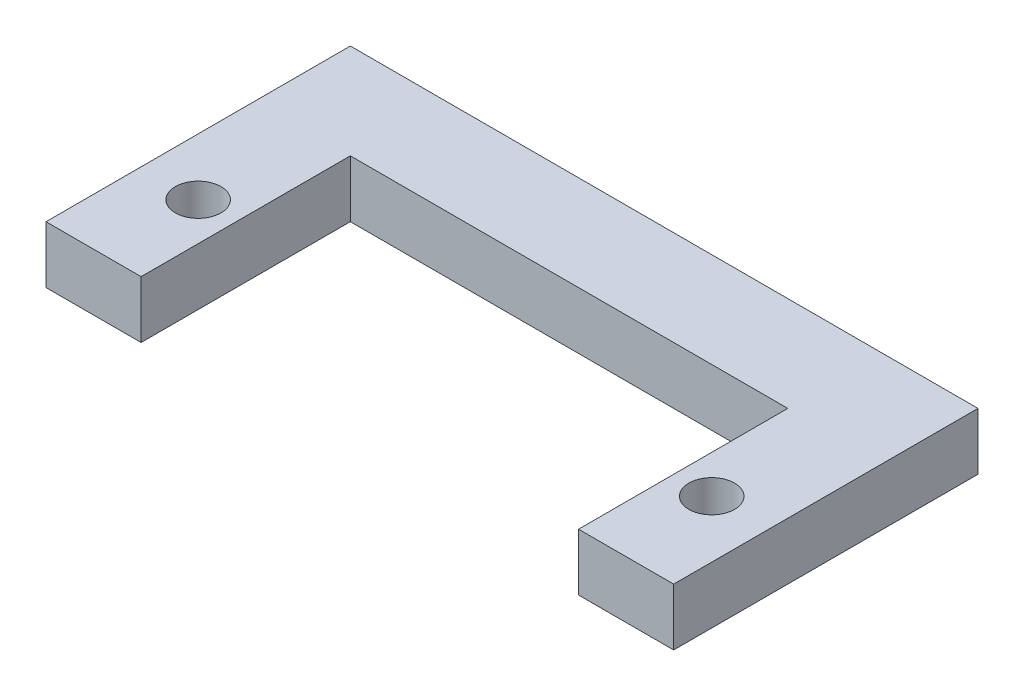
ISO-10303-21;
HEADER;
FILE_DESCRIPTION(('STEP AP214'),'2;1');
FILE_NAME('part.step','',(''),(''),'','','');
FILE_SCHEMA(('AUTOMOTIVE_DESIGN { 1 0 10303 214 1 1 1 1 }'));
ENDSEC;
DATA;
#1=APPLICATION_CONTEXT('core data for automotive mechanical design processes');
#2=APPLICATION_PROTOCOL_DEFINITION('international standard','automotive_design',2000,#1);
#3=PRODUCT_CONTEXT('',#1,'mechanical');
#4=PRODUCT('Part','Part','',(#3));
#5=PRODUCT_RELATED_PRODUCT_CATEGORY('part','',(#4));
#6=PRODUCT_DEFINITION_FORMATION('','',#4);
#7=PRODUCT_DEFINITION_CONTEXT('part definition',#1,'design');
#8=PRODUCT_DEFINITION('design','',#6,#7);
#9=PRODUCT_DEFINITION_SHAPE('','',#8);
#10=(LENGTH_UNIT() NAMED_UNIT(*) SI_UNIT(.MILLI.,.METRE.));
#11=(NAMED_UNIT(*) PLANE_ANGLE_UNIT() SI_UNIT($,.RADIAN.));
#12=(NAMED_UNIT(*) SI_UNIT($,.STERADIAN.) SOLID_ANGLE_UNIT());
#13=UNCERTAINTY_MEASURE_WITH_UNIT(LENGTH_MEASURE(1.E-05),#10,'distance_accuracy_value','');
#14=(GEOMETRIC_REPRESENTATION_CONTEXT(3) GLOBAL_UNCERTAINTY_ASSIGNED_CONTEXT((#13)) GLOBAL_UNIT_ASSIGNED_CONTEXT((#10,
#11,#12)) REPRESENTATION_CONTEXT('',''));
#15=CARTESIAN_POINT('',(0.,0.,0.));
#16=DIRECTION('',(0.,0.,1.));
#17=DIRECTION('',(1.,0.,0.));
#18=AXIS2_PLACEMENT_3D('',#15,#16,#17);
#19=CARTESIAN_POINT('',(0.,3.,0.));
#20=DIRECTION('',(0.,-1.,0.));
#21=DIRECTION('',(0.,0.,-1.));
#22=AXIS2_PLACEMENT_3D('',#19,#20,#21);
#23=PLANE('',#22);
#24=DIRECTION('',(0.,0.,-1.));
#25=VECTOR('',#24,1.);
#26=CARTESIAN_POINT('',(33.,3.,0.));
#27=LINE('',#26,#25);
#28=CARTESIAN_POINT('',(33.,3.,16.));
#29=VERTEX_POINT('',#28);
#30=CARTESIAN_POINT('',(33.,3.,0.));
#31=VERTEX_POINT('',#30);
#32=EDGE_CURVE('E170',#29,#31,#27,.T.);
#33=ORIENTED_EDGE('',*,*,#32,.T.);
#34=DIRECTION('',(-1.,0.,0.));
#35=VECTOR('',#34,1.);
#36=CARTESIAN_POINT('',(0.,3.,0.));
#37=LINE('',#36,#35);
#38=CARTESIAN_POINT('',(0.,3.,0.));
#39=VERTEX_POINT('',#38);
#40=EDGE_CURVE('E106',#31,#39,#37,.T.);
#41=ORIENTED_EDGE('',*,*,#40,.T.);
#42=DIRECTION('',(0.,0.,1.));
#43=VECTOR('',#42,1.);
#44=CARTESIAN_POINT('',(0.,3.,0.));
#45=LINE('',#44,#43);
#46=CARTESIAN_POINT('',(0.,3.,16.));
#47=VERTEX_POINT('',#46);
#48=EDGE_CURVE('E191',#39,#47,#45,.T.);
#49=ORIENTED_EDGE('',*,*,#48,.T.);
#50=DIRECTION('',(1.,0.,0.));
#51=VECTOR('',#50,1.);
#52=CARTESIAN_POINT('',(0.,3.,16.));
#53=LINE('',#52,#51);
#54=CARTESIAN_POINT('',(5.,3.,16.));
#55=VERTEX_POINT('',#54);
#56=EDGE_CURVE('E205',#47,#55,#53,.T.);
#57=ORIENTED_EDGE('',*,*,#56,.T.);
#58=DIRECTION('',(0.,0.,-1.));
#59=VECTOR('',#58,1.);
#60=CARTESIAN_POINT('',(5.,3.,5.));
#61=LINE('',#60,#59);
#62=CARTESIAN_POINT('',(5.,3.,5.));
#63=VERTEX_POINT('',#62);
#64=EDGE_CURVE('E125',#55,#63,#61,.T.);
#65=ORIENTED_EDGE('',*,*,#64,.T.);
#66=DIRECTION('',(1.,0.,0.));
#67=VECTOR('',#66,1.);
#68=CARTESIAN_POINT('',(5.,3.,5.));
#69=LINE('',#68,#67);
#70=CARTESIAN_POINT('',(28.,3.,5.));
#71=VERTEX_POINT('',#70);
#72=EDGE_CURVE('E119',#63,#71,#69,.T.);
#73=ORIENTED_EDGE('',*,*,#72,.T.);
#74=DIRECTION('',(0.,0.,1.));
#75=VECTOR('',#74,1.);
#76=CARTESIAN_POINT('',(28.,3.,5.));
#77=LINE('',#76,#75);
#78=CARTESIAN_POINT('',(28.,3.,16.));
#79=VERTEX_POINT('',#78);
#80=EDGE_CURVE('E123',#71,#79,#77,.T.);
#81=ORIENTED_EDGE('',*,*,#80,.T.);
#82=DIRECTION('',(1.,0.,0.));
#83=VECTOR('',#82,1.);
#84=CARTESIAN_POINT('',(33.,3.,16.));
#85=LINE('',#84,#83);
#86=EDGE_CURVE('E63',#79,#29,#85,.T.);
#87=ORIENTED_EDGE('',*,*,#86,.T.);
#88=EDGE_LOOP('',(#33,#41,#49,#57,#65,#73,#81,#87));
#89=FACE_BOUND('',#88,.T.);
#90=CARTESIAN_POINT('',(3.,3.,11.));
#91=DIRECTION('',(0.,1.,0.));
#92=DIRECTION('',(0.,0.,1.));
#93=AXIS2_PLACEMENT_3D('',#90,#91,#92);
#94=CIRCLE('',#93,1.2);
#95=CARTESIAN_POINT('',(3.,3.,12.2));
#96=VERTEX_POINT('',#95);
#97=EDGE_CURVE('E152',#96,#96,#94,.T.);
#98=ORIENTED_EDGE('',*,*,#97,.F.);
#99=EDGE_LOOP('',(#98));
#100=FACE_BOUND('',#99,.T.);
#101=CARTESIAN_POINT('',(30.,3.,11.));
#102=DIRECTION('',(0.,1.,0.));
#103=DIRECTION('',(0.,0.,1.));
#104=AXIS2_PLACEMENT_3D('',#101,#102,#103);
#105=CIRCLE('',#104,1.2);
#106=CARTESIAN_POINT('',(30.,3.,12.2));
#107=VERTEX_POINT('',#106);
#108=EDGE_CURVE('E219',#107,#107,#105,.T.);
#109=ORIENTED_EDGE('',*,*,#108,.F.);
#110=EDGE_LOOP('',(#109));
#111=FACE_BOUND('',#110,.T.);
#112=ADVANCED_FACE('F45',(#89,#100,#111),#23,.F.);
#113=CARTESIAN_POINT('',(0.,0.,0.));
#114=DIRECTION('',(0.,-1.,0.));
#115=DIRECTION('',(0.,0.,-1.));
#116=AXIS2_PLACEMENT_3D('',#113,#114,#115);
#117=PLANE('',#116);
#118=CARTESIAN_POINT('',(3.,0.,11.));
#119=DIRECTION('',(0.,1.,0.));
#120=DIRECTION('',(0.,0.,1.));
#121=AXIS2_PLACEMENT_3D('',#118,#119,#120);
#122=CIRCLE('',#121,1.2);
#123=CARTESIAN_POINT('',(3.,0.,12.2));
#124=VERTEX_POINT('',#123);
#125=EDGE_CURVE('E215',#124,#124,#122,.T.);
#126=ORIENTED_EDGE('',*,*,#125,.T.);
#127=EDGE_LOOP('',(#126));
#128=FACE_BOUND('',#127,.T.);
#129=DIRECTION('',(0.,0.,-1.));
#130=VECTOR('',#129,1.);
#131=CARTESIAN_POINT('',(33.,0.,0.));
#132=LINE('',#131,#130);
#133=CARTESIAN_POINT('',(33.,0.,16.));
#134=VERTEX_POINT('',#133);
#135=CARTESIAN_POINT('',(33.,0.,0.));
#136=VERTEX_POINT('',#135);
#137=EDGE_CURVE('E147',#134,#136,#132,.T.);
#138=ORIENTED_EDGE('',*,*,#137,.F.);
#139=DIRECTION('',(1.,0.,0.));
#140=VECTOR('',#139,1.);
#141=CARTESIAN_POINT('',(33.,0.,16.));
#142=LINE('',#141,#140);
#143=CARTESIAN_POINT('',(28.,0.,16.));
#144=VERTEX_POINT('',#143);
#145=EDGE_CURVE('E98',#144,#134,#142,.T.);
#146=ORIENTED_EDGE('',*,*,#145,.F.);
#147=DIRECTION('',(0.,0.,1.));
#148=VECTOR('',#147,1.);
#149=CARTESIAN_POINT('',(28.,0.,5.));
#150=LINE('',#149,#148);
#151=CARTESIAN_POINT('',(28.,0.,5.));
#152=VERTEX_POINT('',#151);
#153=EDGE_CURVE('E92',#152,#144,#150,.T.);
#154=ORIENTED_EDGE('',*,*,#153,.F.);
#155=DIRECTION('',(1.,0.,0.));
#156=VECTOR('',#155,1.);
#157=CARTESIAN_POINT('',(5.,0.,5.));
#158=LINE('',#157,#156);
#159=CARTESIAN_POINT('',(5.,0.,5.));
#160=VERTEX_POINT('',#159);
#161=EDGE_CURVE('E134',#160,#152,#158,.T.);
#162=ORIENTED_EDGE('',*,*,#161,.F.);
#163=DIRECTION('',(0.,0.,-1.));
#164=VECTOR('',#163,1.);
#165=CARTESIAN_POINT('',(5.,0.,5.));
#166=LINE('',#165,#164);
#167=CARTESIAN_POINT('',(5.,0.,16.));
#168=VERTEX_POINT('',#167);
#169=EDGE_CURVE('E161',#168,#160,#166,.T.);
#170=ORIENTED_EDGE('',*,*,#169,.F.);
#171=DIRECTION('',(1.,0.,0.));
#172=VECTOR('',#171,1.);
#173=CARTESIAN_POINT('',(0.,0.,16.));
#174=LINE('',#173,#172);
#175=CARTESIAN_POINT('',(0.,0.,16.));
#176=VERTEX_POINT('',#175);
#177=EDGE_CURVE('E158',#176,#168,#174,.T.);
#178=ORIENTED_EDGE('',*,*,#177,.F.);
#179=DIRECTION('',(0.,0.,1.));
#180=VECTOR('',#179,1.);
#181=CARTESIAN_POINT('',(0.,0.,0.));
#182=LINE('',#181,#180);
#183=CARTESIAN_POINT('',(0.,0.,0.));
#184=VERTEX_POINT('',#183);
#185=EDGE_CURVE('E155',#184,#176,#182,.T.);
#186=ORIENTED_EDGE('',*,*,#185,.F.);
#187=DIRECTION('',(-1.,0.,0.));
#188=VECTOR('',#187,1.);
#189=CARTESIAN_POINT('',(0.,0.,0.));
#190=LINE('',#189,#188);
#191=EDGE_CURVE('E151',#136,#184,#190,.T.);
#192=ORIENTED_EDGE('',*,*,#191,.F.);
#193=EDGE_LOOP('',(#138,#146,#154,#162,#170,#178,#186,#192));
#194=FACE_BOUND('',#193,.T.);
#195=CARTESIAN_POINT('',(30.,0.,11.));
#196=DIRECTION('',(0.,1.,0.));
#197=DIRECTION('',(0.,0.,1.));
#198=AXIS2_PLACEMENT_3D('',#195,#196,#197);
#199=CIRCLE('',#198,1.2);
#200=CARTESIAN_POINT('',(30.,0.,12.2));
#201=VERTEX_POINT('',#200);
#202=EDGE_CURVE('E223',#201,#201,#199,.T.);
#203=ORIENTED_EDGE('',*,*,#202,.T.);
#204=EDGE_LOOP('',(#203));
#205=FACE_BOUND('',#204,.T.);
#206=ADVANCED_FACE('F195',(#128,#194,#205),#117,.T.);
#207=CARTESIAN_POINT('',(33.,3.,0.));
#208=DIRECTION('',(-1.,0.,0.));
#209=DIRECTION('',(0.,0.,1.));
#210=AXIS2_PLACEMENT_3D('',#207,#208,#209);
#211=PLANE('',#210);
#212=ORIENTED_EDGE('',*,*,#137,.T.);
#213=DIRECTION('',(0.,-1.,0.));
#214=VECTOR('',#213,1.);
#215=CARTESIAN_POINT('',(33.,3.,0.));
#216=LINE('',#215,#214);
#217=EDGE_CURVE('E11',#31,#136,#216,.T.);
#218=ORIENTED_EDGE('',*,*,#217,.F.);
#219=ORIENTED_EDGE('',*,*,#32,.F.);
#220=DIRECTION('',(0.,-1.,0.));
#221=VECTOR('',#220,1.);
#222=CARTESIAN_POINT('',(33.,3.,16.));
#223=LINE('',#222,#221);
#224=EDGE_CURVE('E143',#29,#134,#223,.T.);
#225=ORIENTED_EDGE('',*,*,#224,.T.);
#226=EDGE_LOOP('',(#212,#218,#219,#225));
#227=FACE_BOUND('',#226,.T.);
#228=ADVANCED_FACE('F47',(#227),#211,.F.);
#229=CARTESIAN_POINT('',(0.,3.,0.));
#230=DIRECTION('',(0.,0.,1.));
#231=DIRECTION('',(1.,0.,0.));
#232=AXIS2_PLACEMENT_3D('',#229,#230,#231);
#233=PLANE('',#232);
#234=ORIENTED_EDGE('',*,*,#191,.T.);
#235=DIRECTION('',(0.,-1.,0.));
#236=VECTOR('',#235,1.);
#237=CARTESIAN_POINT('',(0.,3.,0.));
#238=LINE('',#237,#236);
#239=EDGE_CURVE('E55',#39,#184,#238,.T.);
#240=ORIENTED_EDGE('',*,*,#239,.F.);
#241=ORIENTED_EDGE('',*,*,#40,.F.);
#242=ORIENTED_EDGE('',*,*,#217,.T.);
#243=EDGE_LOOP('',(#234,#240,#241,#242));
#244=FACE_BOUND('',#243,.T.);
#245=ADVANCED_FACE('F257',(#244),#233,.F.);
#246=CARTESIAN_POINT('',(0.,3.,0.));
#247=DIRECTION('',(1.,0.,0.));
#248=DIRECTION('',(0.,0.,-1.));
#249=AXIS2_PLACEMENT_3D('',#246,#247,#248);
#250=PLANE('',#249);
#251=ORIENTED_EDGE('',*,*,#185,.T.);
#252=DIRECTION('',(0.,-1.,0.));
#253=VECTOR('',#252,1.);
#254=CARTESIAN_POINT('',(0.,3.,16.));
#255=LINE('',#254,#253);
#256=EDGE_CURVE('E181',#47,#176,#255,.T.);
#257=ORIENTED_EDGE('',*,*,#256,.F.);
#258=ORIENTED_EDGE('',*,*,#48,.F.);
#259=ORIENTED_EDGE('',*,*,#239,.T.);
#260=EDGE_LOOP('',(#251,#257,#258,#259));
#261=FACE_BOUND('',#260,.T.);
#262=ADVANCED_FACE('F189',(#261),#250,.F.);
#263=CARTESIAN_POINT('',(0.,3.,16.));
#264=DIRECTION('',(0.,0.,-1.));
#265=DIRECTION('',(-1.,0.,0.));
#266=AXIS2_PLACEMENT_3D('',#263,#264,#265);
#267=PLANE('',#266);
#268=ORIENTED_EDGE('',*,*,#177,.T.);
#269=DIRECTION('',(0.,-1.,0.));
#270=VECTOR('',#269,1.);
#271=CARTESIAN_POINT('',(5.,3.,16.));
#272=LINE('',#271,#270);
#273=EDGE_CURVE('E177',#55,#168,#272,.T.);
#274=ORIENTED_EDGE('',*,*,#273,.F.);
#275=ORIENTED_EDGE('',*,*,#56,.F.);
#276=ORIENTED_EDGE('',*,*,#256,.T.);
#277=EDGE_LOOP('',(#268,#274,#275,#276));
#278=FACE_BOUND('',#277,.T.);
#279=ADVANCED_FACE('F200',(#278),#267,.F.);
#280=CARTESIAN_POINT('',(5.,3.,5.));
#281=DIRECTION('',(-1.,0.,0.));
#282=DIRECTION('',(0.,0.,1.));
#283=AXIS2_PLACEMENT_3D('',#280,#281,#282);
#284=PLANE('',#283);
#285=ORIENTED_EDGE('',*,*,#169,.T.);
#286=DIRECTION('',(0.,-1.,0.));
#287=VECTOR('',#286,1.);
#288=CARTESIAN_POINT('',(5.,3.,5.));
#289=LINE('',#288,#287);
#290=EDGE_CURVE('E136',#63,#160,#289,.T.);
#291=ORIENTED_EDGE('',*,*,#290,.F.);
#292=ORIENTED_EDGE('',*,*,#64,.F.);
#293=ORIENTED_EDGE('',*,*,#273,.T.);
#294=EDGE_LOOP('',(#285,#291,#292,#293));
#295=FACE_BOUND('',#294,.T.);
#296=ADVANCED_FACE('F203',(#295),#284,.F.);
#297=CARTESIAN_POINT('',(5.,3.,5.));
#298=DIRECTION('',(0.,0.,-1.));
#299=DIRECTION('',(-1.,0.,0.));
#300=AXIS2_PLACEMENT_3D('',#297,#298,#299);
#301=PLANE('',#300);
#302=ORIENTED_EDGE('',*,*,#161,.T.);
#303=DIRECTION('',(0.,-1.,0.));
#304=VECTOR('',#303,1.);
#305=CARTESIAN_POINT('',(28.,3.,5.));
#306=LINE('',#305,#304);
#307=EDGE_CURVE('E131',#71,#152,#306,.T.);
#308=ORIENTED_EDGE('',*,*,#307,.F.);
#309=ORIENTED_EDGE('',*,*,#72,.F.);
#310=ORIENTED_EDGE('',*,*,#290,.T.);
#311=EDGE_LOOP('',(#302,#308,#309,#310));
#312=FACE_BOUND('',#311,.T.);
#313=ADVANCED_FACE('F132',(#312),#301,.F.);
#314=CARTESIAN_POINT('',(28.,3.,5.));
#315=DIRECTION('',(1.,0.,0.));
#316=DIRECTION('',(0.,0.,-1.));
#317=AXIS2_PLACEMENT_3D('',#314,#315,#316);
#318=PLANE('',#317);
#319=ORIENTED_EDGE('',*,*,#153,.T.);
#320=DIRECTION('',(0.,-1.,0.));
#321=VECTOR('',#320,1.);
#322=CARTESIAN_POINT('',(28.,3.,16.));
#323=LINE('',#322,#321);
#324=EDGE_CURVE('E137',#79,#144,#323,.T.);
#325=ORIENTED_EDGE('',*,*,#324,.F.);
#326=ORIENTED_EDGE('',*,*,#80,.F.);
#327=ORIENTED_EDGE('',*,*,#307,.T.);
#328=EDGE_LOOP('',(#319,#325,#326,#327));
#329=FACE_BOUND('',#328,.T.);
#330=ADVANCED_FACE('F139',(#329),#318,.F.);
#331=CARTESIAN_POINT('',(33.,3.,16.));
#332=DIRECTION('',(0.,0.,-1.));
#333=DIRECTION('',(-1.,0.,0.));
#334=AXIS2_PLACEMENT_3D('',#331,#332,#333);
#335=PLANE('',#334);
#336=ORIENTED_EDGE('',*,*,#145,.T.);
#337=ORIENTED_EDGE('',*,*,#224,.F.);
#338=ORIENTED_EDGE('',*,*,#86,.F.);
#339=ORIENTED_EDGE('',*,*,#324,.T.);
#340=EDGE_LOOP('',(#336,#337,#338,#339));
#341=FACE_BOUND('',#340,.T.);
#342=ADVANCED_FACE('F245',(#341),#335,.F.);
#343=CARTESIAN_POINT('',(3.,3.,11.));
#344=DIRECTION('',(0.,-1.,0.));
#345=DIRECTION('',(0.,0.,-1.));
#346=AXIS2_PLACEMENT_3D('',#343,#344,#345);
#347=CYLINDRICAL_SURFACE('',#346,1.2);
#348=ORIENTED_EDGE('',*,*,#97,.T.);
#349=EDGE_LOOP('',(#348));
#350=FACE_BOUND('',#349,.T.);
#351=ORIENTED_EDGE('',*,*,#125,.F.);
#352=EDGE_LOOP('',(#351));
#353=FACE_BOUND('',#352,.T.);
#354=ADVANCED_FACE('F242',(#350,#353),#347,.F.);
#355=CARTESIAN_POINT('',(30.,3.,11.));
#356=DIRECTION('',(0.,-1.,0.));
#357=DIRECTION('',(0.,0.,-1.));
#358=AXIS2_PLACEMENT_3D('',#355,#356,#357);
#359=CYLINDRICAL_SURFACE('',#358,1.2);
#360=ORIENTED_EDGE('',*,*,#108,.T.);
#361=EDGE_LOOP('',(#360));
#362=FACE_BOUND('',#361,.T.);
#363=ORIENTED_EDGE('',*,*,#202,.F.);
#364=EDGE_LOOP('',(#363));
#365=FACE_BOUND('',#364,.T.);
#366=ADVANCED_FACE('F231',(#362,#365),#359,.F.);
#367=CLOSED_SHELL('',(#112,#206,#228,#245,#262,#279,#296,#313,#330,#342,#354,#366));
#368=MANIFOLD_SOLID_BREP('B2',#367);
#369=ADVANCED_BREP_SHAPE_REPRESENTATION('',(#18,#368),#14);
#370=SHAPE_DEFINITION_REPRESENTATION(#9,#369);
ENDSEC;
END-ISO-10303-21;
